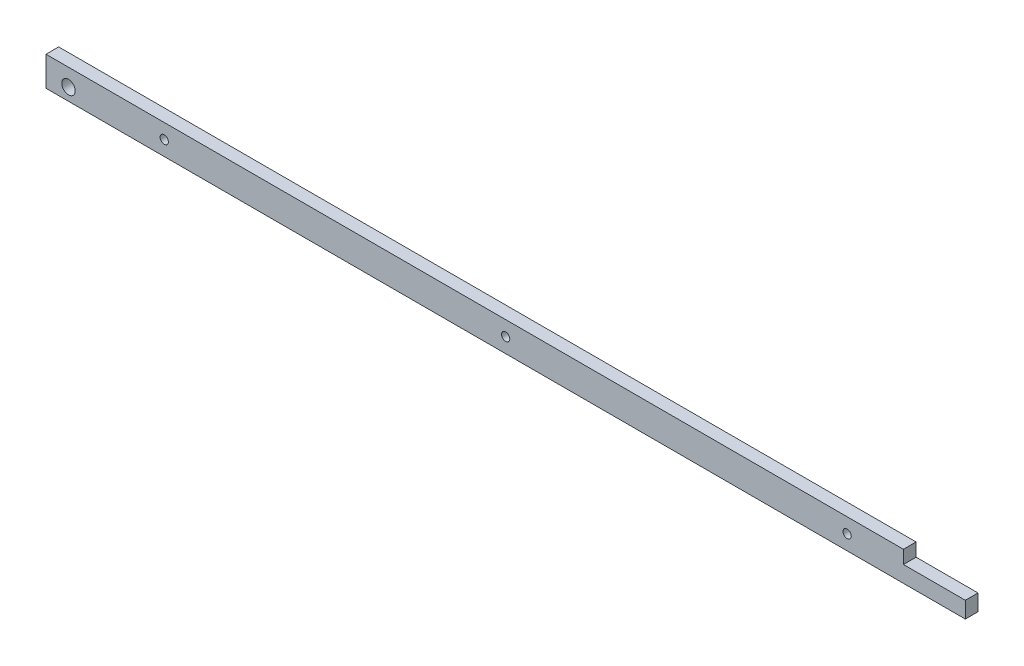
ISO-10303-21;
HEADER;
FILE_DESCRIPTION(('STEP AP214'),'2;1');
FILE_NAME('part.step','',(''),(''),'','','');
FILE_SCHEMA(('AUTOMOTIVE_DESIGN { 1 0 10303 214 1 1 1 1 }'));
ENDSEC;
DATA;
#1=APPLICATION_CONTEXT('core data for automotive mechanical design processes');
#2=APPLICATION_PROTOCOL_DEFINITION('international standard','automotive_design',2000,#1);
#3=PRODUCT_CONTEXT('',#1,'mechanical');
#4=PRODUCT('Part','Part','',(#3));
#5=PRODUCT_RELATED_PRODUCT_CATEGORY('part','',(#4));
#6=PRODUCT_DEFINITION_FORMATION('','',#4);
#7=PRODUCT_DEFINITION_CONTEXT('part definition',#1,'design');
#8=PRODUCT_DEFINITION('design','',#6,#7);
#9=PRODUCT_DEFINITION_SHAPE('','',#8);
#10=(LENGTH_UNIT() NAMED_UNIT(*) SI_UNIT(.MILLI.,.METRE.));
#11=(NAMED_UNIT(*) PLANE_ANGLE_UNIT() SI_UNIT($,.RADIAN.));
#12=(NAMED_UNIT(*) SI_UNIT($,.STERADIAN.) SOLID_ANGLE_UNIT());
#13=UNCERTAINTY_MEASURE_WITH_UNIT(LENGTH_MEASURE(1.E-05),#10,'distance_accuracy_value','');
#14=(GEOMETRIC_REPRESENTATION_CONTEXT(3) GLOBAL_UNCERTAINTY_ASSIGNED_CONTEXT((#13)) GLOBAL_UNIT_ASSIGNED_CONTEXT((#10,
#11,#12)) REPRESENTATION_CONTEXT('',''));
#15=CARTESIAN_POINT('',(0.,0.,0.));
#16=DIRECTION('',(0.,0.,1.));
#17=DIRECTION('',(1.,0.,0.));
#18=AXIS2_PLACEMENT_3D('',#15,#16,#17);
#19=CARTESIAN_POINT('',(0.,0.,-7.62));
#20=DIRECTION('',(0.,0.,1.));
#21=DIRECTION('',(-1.,0.,0.));
#22=AXIS2_PLACEMENT_3D('',#19,#20,#21);
#23=PLANE('',#22);
#24=DIRECTION('',(0.,-1.,0.));
#25=VECTOR('',#24,1.);
#26=CARTESIAN_POINT('',(-1.57859836313889E-13,-4.80058941122077,-7.62));
#27=LINE('',#26,#25);
#28=CARTESIAN_POINT('',(0.,12.9644105887762,-7.62));
#29=VERTEX_POINT('',#28);
#30=CARTESIAN_POINT('',(-1.57859836313889E-13,-4.80058941122077,-7.62));
#31=VERTEX_POINT('',#30);
#32=EDGE_CURVE('E141',#29,#31,#27,.T.);
#33=ORIENTED_EDGE('',*,*,#32,.F.);
#34=DIRECTION('',(-1.,0.,0.));
#35=VECTOR('',#34,1.);
#36=CARTESIAN_POINT('',(0.,12.9644105887762,-7.62));
#37=LINE('',#36,#35);
#38=CARTESIAN_POINT('',(515.860000058,12.9644105887792,-7.62));
#39=VERTEX_POINT('',#38);
#40=EDGE_CURVE('E121',#39,#29,#37,.T.);
#41=ORIENTED_EDGE('',*,*,#40,.F.);
#42=DIRECTION('',(0.,1.,0.));
#43=VECTOR('',#42,1.);
#44=CARTESIAN_POINT('',(515.860000058,12.9644105887792,-7.62));
#45=LINE('',#44,#43);
#46=CARTESIAN_POINT('',(515.860000058,5.01941058877617,-7.62));
#47=VERTEX_POINT('',#46);
#48=EDGE_CURVE('E102',#47,#39,#45,.T.);
#49=ORIENTED_EDGE('',*,*,#48,.F.);
#50=DIRECTION('',(-1.,0.,0.));
#51=VECTOR('',#50,1.);
#52=CARTESIAN_POINT('',(515.860000058,5.01941058877617,-7.62));
#53=LINE('',#52,#51);
#54=CARTESIAN_POINT('',(553.1,5.01941058877617,-7.62));
#55=VERTEX_POINT('',#54);
#56=EDGE_CURVE('E112',#55,#47,#53,.T.);
#57=ORIENTED_EDGE('',*,*,#56,.F.);
#58=DIRECTION('',(0.,1.,0.));
#59=VECTOR('',#58,1.);
#60=CARTESIAN_POINT('',(553.1,5.01941058877617,-7.62));
#61=LINE('',#60,#59);
#62=CARTESIAN_POINT('',(553.1,-4.80058941122084,-7.62));
#63=VERTEX_POINT('',#62);
#64=EDGE_CURVE('E117',#63,#55,#61,.T.);
#65=ORIENTED_EDGE('',*,*,#64,.F.);
#66=DIRECTION('',(1.,0.,0.));
#67=VECTOR('',#66,1.);
#68=CARTESIAN_POINT('',(-1.57859836313889E-13,-4.80058941122077,-7.62));
#69=LINE('',#68,#67);
#70=EDGE_CURVE('E146',#31,#63,#69,.T.);
#71=ORIENTED_EDGE('',*,*,#70,.F.);
#72=EDGE_LOOP('',(#33,#41,#49,#57,#65,#71));
#73=FACE_BOUND('',#72,.T.);
#74=CARTESIAN_POINT('',(481.98,4.08191058877922,-7.62));
#75=DIRECTION('',(0.,0.,1.));
#76=DIRECTION('',(1.,0.,0.));
#77=AXIS2_PLACEMENT_3D('',#74,#75,#76);
#78=CIRCLE('',#77,2.48919999999925);
#79=CARTESIAN_POINT('',(479.490800000001,4.08191058877922,-7.62));
#80=VERTEX_POINT('',#79);
#81=EDGE_CURVE('E130',#80,#80,#78,.T.);
#82=ORIENTED_EDGE('',*,*,#81,.T.);
#83=EDGE_LOOP('',(#82));
#84=FACE_BOUND('',#83,.T.);
#85=CARTESIAN_POINT('',(276.55,4.08191058877922,-7.62));
#86=DIRECTION('',(0.,0.,1.));
#87=DIRECTION('',(1.,0.,0.));
#88=AXIS2_PLACEMENT_3D('',#85,#86,#87);
#89=CIRCLE('',#88,2.48920000000001);
#90=CARTESIAN_POINT('',(274.0608,4.08191058877922,-7.62));
#91=VERTEX_POINT('',#90);
#92=EDGE_CURVE('E158',#91,#91,#89,.T.);
#93=ORIENTED_EDGE('',*,*,#92,.T.);
#94=EDGE_LOOP('',(#93));
#95=FACE_BOUND('',#94,.T.);
#96=CARTESIAN_POINT('',(71.1199999999998,4.08191058877922,-7.62));
#97=DIRECTION('',(0.,0.,1.));
#98=DIRECTION('',(1.,0.,0.));
#99=AXIS2_PLACEMENT_3D('',#96,#97,#98);
#100=CIRCLE('',#99,2.4892);
#101=CARTESIAN_POINT('',(68.6307999999998,4.08191058877922,-7.62));
#102=VERTEX_POINT('',#101);
#103=EDGE_CURVE('E164',#102,#102,#100,.T.);
#104=ORIENTED_EDGE('',*,*,#103,.T.);
#105=EDGE_LOOP('',(#104));
#106=FACE_BOUND('',#105,.T.);
#107=CARTESIAN_POINT('',(13.5399999999998,2.59941058877923,-7.62));
#108=DIRECTION('',(0.,0.,1.));
#109=DIRECTION('',(1.,0.,0.));
#110=AXIS2_PLACEMENT_3D('',#107,#108,#109);
#111=CIRCLE('',#110,4.0635);
#112=CARTESIAN_POINT('',(9.47649999999985,2.59941058877923,-7.62));
#113=VERTEX_POINT('',#112);
#114=EDGE_CURVE('E170',#113,#113,#111,.T.);
#115=ORIENTED_EDGE('',*,*,#114,.T.);
#116=EDGE_LOOP('',(#115));
#117=FACE_BOUND('',#116,.T.);
#118=ADVANCED_FACE('F41',(#73,#84,#95,#106,#117),#23,.F.);
#119=CARTESIAN_POINT('',(0.,0.,0.));
#120=DIRECTION('',(0.,0.,1.));
#121=DIRECTION('',(-1.,0.,0.));
#122=AXIS2_PLACEMENT_3D('',#119,#120,#121);
#123=PLANE('',#122);
#124=CARTESIAN_POINT('',(71.1199999999998,4.08191058877922,0.));
#125=DIRECTION('',(0.,0.,1.));
#126=DIRECTION('',(1.,0.,0.));
#127=AXIS2_PLACEMENT_3D('',#124,#125,#126);
#128=CIRCLE('',#127,2.4892);
#129=CARTESIAN_POINT('',(68.6307999999998,4.08191058877922,0.));
#130=VERTEX_POINT('',#129);
#131=EDGE_CURVE('E167',#130,#130,#128,.T.);
#132=ORIENTED_EDGE('',*,*,#131,.F.);
#133=EDGE_LOOP('',(#132));
#134=FACE_BOUND('',#133,.T.);
#135=CARTESIAN_POINT('',(481.98,4.08191058877922,0.));
#136=DIRECTION('',(0.,0.,1.));
#137=DIRECTION('',(1.,0.,0.));
#138=AXIS2_PLACEMENT_3D('',#135,#136,#137);
#139=CIRCLE('',#138,2.48919999999925);
#140=CARTESIAN_POINT('',(479.490800000001,4.08191058877922,0.));
#141=VERTEX_POINT('',#140);
#142=EDGE_CURVE('E155',#141,#141,#139,.T.);
#143=ORIENTED_EDGE('',*,*,#142,.F.);
#144=EDGE_LOOP('',(#143));
#145=FACE_BOUND('',#144,.T.);
#146=DIRECTION('',(0.,-1.,0.));
#147=VECTOR('',#146,1.);
#148=CARTESIAN_POINT('',(-1.57859836313889E-13,-4.80058941122077,0.));
#149=LINE('',#148,#147);
#150=CARTESIAN_POINT('',(0.,12.9644105887762,0.));
#151=VERTEX_POINT('',#150);
#152=CARTESIAN_POINT('',(-1.57859836313889E-13,-4.80058941122077,0.));
#153=VERTEX_POINT('',#152);
#154=EDGE_CURVE('E126',#151,#153,#149,.T.);
#155=ORIENTED_EDGE('',*,*,#154,.T.);
#156=DIRECTION('',(1.,0.,0.));
#157=VECTOR('',#156,1.);
#158=CARTESIAN_POINT('',(-1.57859836313889E-13,-4.80058941122077,0.));
#159=LINE('',#158,#157);
#160=CARTESIAN_POINT('',(553.1,-4.80058941122084,0.));
#161=VERTEX_POINT('',#160);
#162=EDGE_CURVE('E129',#153,#161,#159,.T.);
#163=ORIENTED_EDGE('',*,*,#162,.T.);
#164=DIRECTION('',(0.,1.,0.));
#165=VECTOR('',#164,1.);
#166=CARTESIAN_POINT('',(553.1,5.01941058877617,0.));
#167=LINE('',#166,#165);
#168=CARTESIAN_POINT('',(553.1,5.01941058877617,0.));
#169=VERTEX_POINT('',#168);
#170=EDGE_CURVE('E133',#161,#169,#167,.T.);
#171=ORIENTED_EDGE('',*,*,#170,.T.);
#172=DIRECTION('',(-1.,0.,0.));
#173=VECTOR('',#172,1.);
#174=CARTESIAN_POINT('',(515.860000058,5.01941058877617,0.));
#175=LINE('',#174,#173);
#176=CARTESIAN_POINT('',(515.860000058,5.01941058877617,0.));
#177=VERTEX_POINT('',#176);
#178=EDGE_CURVE('E136',#169,#177,#175,.T.);
#179=ORIENTED_EDGE('',*,*,#178,.T.);
#180=DIRECTION('',(0.,1.,0.));
#181=VECTOR('',#180,1.);
#182=CARTESIAN_POINT('',(515.860000058,12.9644105887792,0.));
#183=LINE('',#182,#181);
#184=CARTESIAN_POINT('',(515.860000058,12.9644105887792,0.));
#185=VERTEX_POINT('',#184);
#186=EDGE_CURVE('E105',#177,#185,#183,.T.);
#187=ORIENTED_EDGE('',*,*,#186,.T.);
#188=DIRECTION('',(-1.,0.,0.));
#189=VECTOR('',#188,1.);
#190=CARTESIAN_POINT('',(0.,12.9644105887762,0.));
#191=LINE('',#190,#189);
#192=EDGE_CURVE('E139',#185,#151,#191,.T.);
#193=ORIENTED_EDGE('',*,*,#192,.T.);
#194=EDGE_LOOP('',(#155,#163,#171,#179,#187,#193));
#195=FACE_BOUND('',#194,.T.);
#196=CARTESIAN_POINT('',(276.55,4.08191058877922,0.));
#197=DIRECTION('',(0.,0.,1.));
#198=DIRECTION('',(1.,0.,0.));
#199=AXIS2_PLACEMENT_3D('',#196,#197,#198);
#200=CIRCLE('',#199,2.48920000000001);
#201=CARTESIAN_POINT('',(274.0608,4.08191058877922,0.));
#202=VERTEX_POINT('',#201);
#203=EDGE_CURVE('E161',#202,#202,#200,.T.);
#204=ORIENTED_EDGE('',*,*,#203,.F.);
#205=EDGE_LOOP('',(#204));
#206=FACE_BOUND('',#205,.T.);
#207=CARTESIAN_POINT('',(13.5399999999998,2.59941058877923,0.));
#208=DIRECTION('',(0.,0.,1.));
#209=DIRECTION('',(1.,0.,0.));
#210=AXIS2_PLACEMENT_3D('',#207,#208,#209);
#211=CIRCLE('',#210,4.0635);
#212=CARTESIAN_POINT('',(9.47649999999985,2.59941058877923,0.));
#213=VERTEX_POINT('',#212);
#214=EDGE_CURVE('E173',#213,#213,#211,.T.);
#215=ORIENTED_EDGE('',*,*,#214,.F.);
#216=EDGE_LOOP('',(#215));
#217=FACE_BOUND('',#216,.T.);
#218=ADVANCED_FACE('F150',(#134,#145,#195,#206,#217),#123,.T.);
#219=CARTESIAN_POINT('',(-1.57859836313889E-13,-4.80058941122077,-7.62));
#220=DIRECTION('',(1.,0.,0.));
#221=DIRECTION('',(0.,1.,0.));
#222=AXIS2_PLACEMENT_3D('',#219,#220,#221);
#223=PLANE('',#222);
#224=ORIENTED_EDGE('',*,*,#154,.F.);
#225=DIRECTION('',(0.,0.,1.));
#226=VECTOR('',#225,1.);
#227=CARTESIAN_POINT('',(0.,12.9644105887762,-7.62));
#228=LINE('',#227,#226);
#229=EDGE_CURVE('E58',#29,#151,#228,.T.);
#230=ORIENTED_EDGE('',*,*,#229,.F.);
#231=ORIENTED_EDGE('',*,*,#32,.T.);
#232=DIRECTION('',(0.,0.,1.));
#233=VECTOR('',#232,1.);
#234=CARTESIAN_POINT('',(-1.57859836313889E-13,-4.80058941122077,-7.62));
#235=LINE('',#234,#233);
#236=EDGE_CURVE('E11',#31,#153,#235,.T.);
#237=ORIENTED_EDGE('',*,*,#236,.T.);
#238=EDGE_LOOP('',(#224,#230,#231,#237));
#239=FACE_BOUND('',#238,.T.);
#240=ADVANCED_FACE('F43',(#239),#223,.F.);
#241=CARTESIAN_POINT('',(-1.57859836313889E-13,-4.80058941122077,-7.62));
#242=DIRECTION('',(0.,1.,0.));
#243=DIRECTION('',(-1.,0.,0.));
#244=AXIS2_PLACEMENT_3D('',#241,#242,#243);
#245=PLANE('',#244);
#246=ORIENTED_EDGE('',*,*,#162,.F.);
#247=ORIENTED_EDGE('',*,*,#236,.F.);
#248=ORIENTED_EDGE('',*,*,#70,.T.);
#249=DIRECTION('',(0.,0.,1.));
#250=VECTOR('',#249,1.);
#251=CARTESIAN_POINT('',(553.1,-4.80058941122084,-7.62));
#252=LINE('',#251,#250);
#253=EDGE_CURVE('E50',#63,#161,#252,.T.);
#254=ORIENTED_EDGE('',*,*,#253,.T.);
#255=EDGE_LOOP('',(#246,#247,#248,#254));
#256=FACE_BOUND('',#255,.T.);
#257=ADVANCED_FACE('F145',(#256),#245,.F.);
#258=CARTESIAN_POINT('',(553.1,5.01941058877617,-7.62));
#259=DIRECTION('',(-1.,0.,0.));
#260=DIRECTION('',(0.,0.,-1.));
#261=AXIS2_PLACEMENT_3D('',#258,#259,#260);
#262=PLANE('',#261);
#263=ORIENTED_EDGE('',*,*,#170,.F.);
#264=ORIENTED_EDGE('',*,*,#253,.F.);
#265=ORIENTED_EDGE('',*,*,#64,.T.);
#266=DIRECTION('',(0.,0.,1.));
#267=VECTOR('',#266,1.);
#268=CARTESIAN_POINT('',(553.1,5.01941058877617,-7.62));
#269=LINE('',#268,#267);
#270=EDGE_CURVE('E109',#55,#169,#269,.T.);
#271=ORIENTED_EDGE('',*,*,#270,.T.);
#272=EDGE_LOOP('',(#263,#264,#265,#271));
#273=FACE_BOUND('',#272,.T.);
#274=ADVANCED_FACE('F148',(#273),#262,.F.);
#275=CARTESIAN_POINT('',(515.860000058,5.01941058877617,-7.62));
#276=DIRECTION('',(0.,-1.,0.));
#277=DIRECTION('',(0.,0.,1.));
#278=AXIS2_PLACEMENT_3D('',#275,#276,#277);
#279=PLANE('',#278);
#280=ORIENTED_EDGE('',*,*,#178,.F.);
#281=ORIENTED_EDGE('',*,*,#270,.F.);
#282=ORIENTED_EDGE('',*,*,#56,.T.);
#283=DIRECTION('',(0.,0.,1.));
#284=VECTOR('',#283,1.);
#285=CARTESIAN_POINT('',(515.860000058,5.01941058877617,-7.62));
#286=LINE('',#285,#284);
#287=EDGE_CURVE('E98',#47,#177,#286,.T.);
#288=ORIENTED_EDGE('',*,*,#287,.T.);
#289=EDGE_LOOP('',(#280,#281,#282,#288));
#290=FACE_BOUND('',#289,.T.);
#291=ADVANCED_FACE('F113',(#290),#279,.F.);
#292=CARTESIAN_POINT('',(515.860000058,12.9644105887792,-7.62));
#293=DIRECTION('',(-1.,0.,0.));
#294=DIRECTION('',(0.,0.,-1.));
#295=AXIS2_PLACEMENT_3D('',#292,#293,#294);
#296=PLANE('',#295);
#297=ORIENTED_EDGE('',*,*,#186,.F.);
#298=ORIENTED_EDGE('',*,*,#287,.F.);
#299=ORIENTED_EDGE('',*,*,#48,.T.);
#300=DIRECTION('',(0.,0.,1.));
#301=VECTOR('',#300,1.);
#302=CARTESIAN_POINT('',(515.860000058,12.9644105887792,-7.62));
#303=LINE('',#302,#301);
#304=EDGE_CURVE('E80',#39,#185,#303,.T.);
#305=ORIENTED_EDGE('',*,*,#304,.T.);
#306=EDGE_LOOP('',(#297,#298,#299,#305));
#307=FACE_BOUND('',#306,.T.);
#308=ADVANCED_FACE('F100',(#307),#296,.F.);
#309=CARTESIAN_POINT('',(0.,12.9644105887762,-7.62));
#310=DIRECTION('',(0.,-1.,0.));
#311=DIRECTION('',(1.,0.,0.));
#312=AXIS2_PLACEMENT_3D('',#309,#310,#311);
#313=PLANE('',#312);
#314=ORIENTED_EDGE('',*,*,#192,.F.);
#315=ORIENTED_EDGE('',*,*,#304,.F.);
#316=ORIENTED_EDGE('',*,*,#40,.T.);
#317=ORIENTED_EDGE('',*,*,#229,.T.);
#318=EDGE_LOOP('',(#314,#315,#316,#317));
#319=FACE_BOUND('',#318,.T.);
#320=ADVANCED_FACE('F199',(#319),#313,.F.);
#321=CARTESIAN_POINT('',(481.98,4.08191058877922,-7.62));
#322=DIRECTION('',(0.,0.,1.));
#323=DIRECTION('',(-1.,0.,0.));
#324=AXIS2_PLACEMENT_3D('',#321,#322,#323);
#325=CYLINDRICAL_SURFACE('',#324,2.48919999999925);
#326=CARTESIAN_POINT('',(479.490800000001,4.08191058877922,-7.62));
#327=CARTESIAN_POINT('',(479.490800000001,4.08191058877922,-7.540625));
#328=CARTESIAN_POINT('',(479.490800000001,4.08191058877922,-7.46125));
#329=CARTESIAN_POINT('',(479.490800000001,4.08191058877922,-7.3025));
#330=CARTESIAN_POINT('',(479.490800000001,4.08191058877922,-7.223125));
#331=CARTESIAN_POINT('',(479.490800000001,4.08191058877922,-7.064375));
#332=CARTESIAN_POINT('',(479.490800000001,4.08191058877922,-6.985));
#333=CARTESIAN_POINT('',(479.490800000001,4.08191058877922,-6.82625));
#334=CARTESIAN_POINT('',(479.490800000001,4.08191058877922,-6.746875));
#335=CARTESIAN_POINT('',(479.490800000001,4.08191058877922,-6.588125));
#336=CARTESIAN_POINT('',(479.490800000001,4.08191058877922,-6.50875));
#337=CARTESIAN_POINT('',(479.490800000001,4.08191058877922,-6.35));
#338=CARTESIAN_POINT('',(479.490800000001,4.08191058877922,-6.270625));
#339=CARTESIAN_POINT('',(479.490800000001,4.08191058877922,-6.111875));
#340=CARTESIAN_POINT('',(479.490800000001,4.08191058877922,-6.0325));
#341=CARTESIAN_POINT('',(479.490800000001,4.08191058877922,-5.87375));
#342=CARTESIAN_POINT('',(479.490800000001,4.08191058877922,-5.794375));
#343=CARTESIAN_POINT('',(479.490800000001,4.08191058877922,-5.635625));
#344=CARTESIAN_POINT('',(479.490800000001,4.08191058877922,-5.55625));
#345=CARTESIAN_POINT('',(479.490800000001,4.08191058877922,-5.3975));
#346=CARTESIAN_POINT('',(479.490800000001,4.08191058877922,-5.318125));
#347=CARTESIAN_POINT('',(479.490800000001,4.08191058877922,-5.159375));
#348=CARTESIAN_POINT('',(479.490800000001,4.08191058877922,-5.08));
#349=CARTESIAN_POINT('',(479.490800000001,4.08191058877922,-4.92125));
#350=CARTESIAN_POINT('',(479.490800000001,4.08191058877922,-4.841875));
#351=CARTESIAN_POINT('',(479.490800000001,4.08191058877922,-4.683125));
#352=CARTESIAN_POINT('',(479.490800000001,4.08191058877922,-4.60375));
#353=CARTESIAN_POINT('',(479.490800000001,4.08191058877922,-4.445));
#354=CARTESIAN_POINT('',(479.490800000001,4.08191058877922,-4.365625));
#355=CARTESIAN_POINT('',(479.490800000001,4.08191058877922,-4.206875));
#356=CARTESIAN_POINT('',(479.490800000001,4.08191058877922,-4.1275));
#357=CARTESIAN_POINT('',(479.490800000001,4.08191058877922,-3.96875));
#358=CARTESIAN_POINT('',(479.490800000001,4.08191058877922,-3.889375));
#359=CARTESIAN_POINT('',(479.490800000001,4.08191058877922,-3.730625));
#360=CARTESIAN_POINT('',(479.490800000001,4.08191058877922,-3.65125));
#361=CARTESIAN_POINT('',(479.490800000001,4.08191058877922,-3.4925));
#362=CARTESIAN_POINT('',(479.490800000001,4.08191058877922,-3.413125));
#363=CARTESIAN_POINT('',(479.490800000001,4.08191058877922,-3.254375));
#364=CARTESIAN_POINT('',(479.490800000001,4.08191058877922,-3.175));
#365=CARTESIAN_POINT('',(479.490800000001,4.08191058877922,-3.01625));
#366=CARTESIAN_POINT('',(479.490800000001,4.08191058877922,-2.936875));
#367=CARTESIAN_POINT('',(479.490800000001,4.08191058877922,-2.778125));
#368=CARTESIAN_POINT('',(479.490800000001,4.08191058877922,-2.69875));
#369=CARTESIAN_POINT('',(479.490800000001,4.08191058877922,-2.54));
#370=CARTESIAN_POINT('',(479.490800000001,4.08191058877922,-2.460625));
#371=CARTESIAN_POINT('',(479.490800000001,4.08191058877922,-2.301875));
#372=CARTESIAN_POINT('',(479.490800000001,4.08191058877922,-2.2225));
#373=CARTESIAN_POINT('',(479.490800000001,4.08191058877922,-2.06375));
#374=CARTESIAN_POINT('',(479.490800000001,4.08191058877922,-1.984375));
#375=CARTESIAN_POINT('',(479.490800000001,4.08191058877922,-1.825625));
#376=CARTESIAN_POINT('',(479.490800000001,4.08191058877922,-1.74625));
#377=CARTESIAN_POINT('',(479.490800000001,4.08191058877922,-1.5875));
#378=CARTESIAN_POINT('',(479.490800000001,4.08191058877922,-1.508125));
#379=CARTESIAN_POINT('',(479.490800000001,4.08191058877922,-1.349375));
#380=CARTESIAN_POINT('',(479.490800000001,4.08191058877922,-1.27));
#381=CARTESIAN_POINT('',(479.490800000001,4.08191058877922,-1.11125));
#382=CARTESIAN_POINT('',(479.490800000001,4.08191058877922,-1.031875));
#383=CARTESIAN_POINT('',(479.490800000001,4.08191058877922,-0.873125));
#384=CARTESIAN_POINT('',(479.490800000001,4.08191058877922,-0.79375));
#385=CARTESIAN_POINT('',(479.490800000001,4.08191058877922,-0.635));
#386=CARTESIAN_POINT('',(479.490800000001,4.08191058877922,-0.555625));
#387=CARTESIAN_POINT('',(479.490800000001,4.08191058877922,-0.396875));
#388=CARTESIAN_POINT('',(479.490800000001,4.08191058877922,-0.3175));
#389=CARTESIAN_POINT('',(479.490800000001,4.08191058877922,-0.15875));
#390=CARTESIAN_POINT('',(479.490800000001,4.08191058877922,-0.0793749999999999));
#391=CARTESIAN_POINT('',(479.490800000001,4.08191058877922,0.));
#392=B_SPLINE_CURVE_WITH_KNOTS('',3,(#326,#327,#328,#329,#330,#331,#332,#333,#334,#335,#336,
#337,#338,#339,#340,#341,#342,#343,#344,#345,#346,#347,#348,#349,#350,#351,#352,#353,#354,#355,
#356,#357,#358,#359,#360,#361,#362,#363,#364,#365,#366,#367,#368,#369,#370,#371,#372,#373,#374,
#375,#376,#377,#378,#379,#380,#381,#382,#383,#384,#385,#386,#387,#388,#389,#390,#391),
.UNSPECIFIED.,.F.,.F.,(4,2,2,2,2,2,2,2,2,2,2,2,2,2,2,2,2,2,2,2,2,2,2,2,2,2,2,2,2,2,2,2,4),(0.,
0.238125,0.476249999999999,0.714375,0.952499999999999,1.190625,1.42875,1.666875,1.905,2.143125,
2.38125,2.619375,2.8575,3.095625,3.33375,3.571875,3.81,4.048125,4.28625,4.524375,4.7625,
5.000625,5.23875,5.476875,5.715,5.953125,6.19125,6.429375,6.6675,6.905625,7.14375,7.381875,
7.62),.UNSPECIFIED.);
#393=EDGE_CURVE('BSEAM202',#80,#141,#392,.T.);
#394=ORIENTED_EDGE('',*,*,#81,.F.);
#395=ORIENTED_EDGE('',*,*,#142,.T.);
#396=ORIENTED_EDGE('',*,*,#393,.T.);
#397=ORIENTED_EDGE('',*,*,#393,.F.);
#398=EDGE_LOOP('',(#394,#396,#395,#397));
#399=FACE_BOUND('',#398,.T.);
#400=ADVANCED_FACE('F202',(#399),#325,.F.);
#401=CARTESIAN_POINT('',(276.55,4.08191058877922,-7.62));
#402=DIRECTION('',(0.,0.,1.));
#403=DIRECTION('',(-1.,0.,0.));
#404=AXIS2_PLACEMENT_3D('',#401,#402,#403);
#405=CYLINDRICAL_SURFACE('',#404,2.48920000000001);
#406=CARTESIAN_POINT('',(274.0608,4.08191058877922,-7.62));
#407=CARTESIAN_POINT('',(274.0608,4.08191058877922,-7.540625));
#408=CARTESIAN_POINT('',(274.0608,4.08191058877922,-7.46125));
#409=CARTESIAN_POINT('',(274.0608,4.08191058877922,-7.3025));
#410=CARTESIAN_POINT('',(274.0608,4.08191058877922,-7.223125));
#411=CARTESIAN_POINT('',(274.0608,4.08191058877922,-7.064375));
#412=CARTESIAN_POINT('',(274.0608,4.08191058877922,-6.985));
#413=CARTESIAN_POINT('',(274.0608,4.08191058877922,-6.82625));
#414=CARTESIAN_POINT('',(274.0608,4.08191058877922,-6.746875));
#415=CARTESIAN_POINT('',(274.0608,4.08191058877922,-6.588125));
#416=CARTESIAN_POINT('',(274.0608,4.08191058877922,-6.50875));
#417=CARTESIAN_POINT('',(274.0608,4.08191058877922,-6.35));
#418=CARTESIAN_POINT('',(274.0608,4.08191058877922,-6.270625));
#419=CARTESIAN_POINT('',(274.0608,4.08191058877922,-6.111875));
#420=CARTESIAN_POINT('',(274.0608,4.08191058877922,-6.0325));
#421=CARTESIAN_POINT('',(274.0608,4.08191058877922,-5.87375));
#422=CARTESIAN_POINT('',(274.0608,4.08191058877922,-5.794375));
#423=CARTESIAN_POINT('',(274.0608,4.08191058877922,-5.635625));
#424=CARTESIAN_POINT('',(274.0608,4.08191058877922,-5.55625));
#425=CARTESIAN_POINT('',(274.0608,4.08191058877922,-5.3975));
#426=CARTESIAN_POINT('',(274.0608,4.08191058877922,-5.318125));
#427=CARTESIAN_POINT('',(274.0608,4.08191058877922,-5.159375));
#428=CARTESIAN_POINT('',(274.0608,4.08191058877922,-5.08));
#429=CARTESIAN_POINT('',(274.0608,4.08191058877922,-4.92125));
#430=CARTESIAN_POINT('',(274.0608,4.08191058877922,-4.841875));
#431=CARTESIAN_POINT('',(274.0608,4.08191058877922,-4.683125));
#432=CARTESIAN_POINT('',(274.0608,4.08191058877922,-4.60375));
#433=CARTESIAN_POINT('',(274.0608,4.08191058877922,-4.445));
#434=CARTESIAN_POINT('',(274.0608,4.08191058877922,-4.365625));
#435=CARTESIAN_POINT('',(274.0608,4.08191058877922,-4.206875));
#436=CARTESIAN_POINT('',(274.0608,4.08191058877922,-4.1275));
#437=CARTESIAN_POINT('',(274.0608,4.08191058877922,-3.96875));
#438=CARTESIAN_POINT('',(274.0608,4.08191058877922,-3.889375));
#439=CARTESIAN_POINT('',(274.0608,4.08191058877922,-3.730625));
#440=CARTESIAN_POINT('',(274.0608,4.08191058877922,-3.65125));
#441=CARTESIAN_POINT('',(274.0608,4.08191058877922,-3.4925));
#442=CARTESIAN_POINT('',(274.0608,4.08191058877922,-3.413125));
#443=CARTESIAN_POINT('',(274.0608,4.08191058877922,-3.254375));
#444=CARTESIAN_POINT('',(274.0608,4.08191058877922,-3.175));
#445=CARTESIAN_POINT('',(274.0608,4.08191058877922,-3.01625));
#446=CARTESIAN_POINT('',(274.0608,4.08191058877922,-2.936875));
#447=CARTESIAN_POINT('',(274.0608,4.08191058877922,-2.778125));
#448=CARTESIAN_POINT('',(274.0608,4.08191058877922,-2.69875));
#449=CARTESIAN_POINT('',(274.0608,4.08191058877922,-2.54));
#450=CARTESIAN_POINT('',(274.0608,4.08191058877922,-2.460625));
#451=CARTESIAN_POINT('',(274.0608,4.08191058877922,-2.301875));
#452=CARTESIAN_POINT('',(274.0608,4.08191058877922,-2.2225));
#453=CARTESIAN_POINT('',(274.0608,4.08191058877922,-2.06375));
#454=CARTESIAN_POINT('',(274.0608,4.08191058877922,-1.984375));
#455=CARTESIAN_POINT('',(274.0608,4.08191058877922,-1.825625));
#456=CARTESIAN_POINT('',(274.0608,4.08191058877922,-1.74625));
#457=CARTESIAN_POINT('',(274.0608,4.08191058877922,-1.5875));
#458=CARTESIAN_POINT('',(274.0608,4.08191058877922,-1.508125));
#459=CARTESIAN_POINT('',(274.0608,4.08191058877922,-1.349375));
#460=CARTESIAN_POINT('',(274.0608,4.08191058877922,-1.27));
#461=CARTESIAN_POINT('',(274.0608,4.08191058877922,-1.11125));
#462=CARTESIAN_POINT('',(274.0608,4.08191058877922,-1.031875));
#463=CARTESIAN_POINT('',(274.0608,4.08191058877922,-0.873125));
#464=CARTESIAN_POINT('',(274.0608,4.08191058877922,-0.79375));
#465=CARTESIAN_POINT('',(274.0608,4.08191058877922,-0.635));
#466=CARTESIAN_POINT('',(274.0608,4.08191058877922,-0.555625));
#467=CARTESIAN_POINT('',(274.0608,4.08191058877922,-0.396875));
#468=CARTESIAN_POINT('',(274.0608,4.08191058877922,-0.3175));
#469=CARTESIAN_POINT('',(274.0608,4.08191058877922,-0.15875));
#470=CARTESIAN_POINT('',(274.0608,4.08191058877922,-0.0793749999999999));
#471=CARTESIAN_POINT('',(274.0608,4.08191058877922,0.));
#472=B_SPLINE_CURVE_WITH_KNOTS('',3,(#406,#407,#408,#409,#410,#411,#412,#413,#414,#415,#416,
#417,#418,#419,#420,#421,#422,#423,#424,#425,#426,#427,#428,#429,#430,#431,#432,#433,#434,#435,
#436,#437,#438,#439,#440,#441,#442,#443,#444,#445,#446,#447,#448,#449,#450,#451,#452,#453,#454,
#455,#456,#457,#458,#459,#460,#461,#462,#463,#464,#465,#466,#467,#468,#469,#470,#471),
.UNSPECIFIED.,.F.,.F.,(4,2,2,2,2,2,2,2,2,2,2,2,2,2,2,2,2,2,2,2,2,2,2,2,2,2,2,2,2,2,2,2,4),(0.,
0.238125,0.476249999999999,0.714375,0.952499999999999,1.190625,1.42875,1.666875,1.905,2.143125,
2.38125,2.619375,2.8575,3.095625,3.33375,3.571875,3.81,4.048125,4.28625,4.524375,4.7625,
5.000625,5.23875,5.476875,5.715,5.953125,6.19125,6.429375,6.6675,6.905625,7.14375,7.381875,
7.62),.UNSPECIFIED.);
#473=EDGE_CURVE('BSEAM240',#91,#202,#472,.T.);
#474=ORIENTED_EDGE('',*,*,#92,.F.);
#475=ORIENTED_EDGE('',*,*,#203,.T.);
#476=ORIENTED_EDGE('',*,*,#473,.T.);
#477=ORIENTED_EDGE('',*,*,#473,.F.);
#478=EDGE_LOOP('',(#474,#476,#475,#477));
#479=FACE_BOUND('',#478,.T.);
#480=ADVANCED_FACE('F240',(#479),#405,.F.);
#481=CARTESIAN_POINT('',(71.1199999999998,4.08191058877922,-7.62));
#482=DIRECTION('',(0.,0.,1.));
#483=DIRECTION('',(-1.,0.,0.));
#484=AXIS2_PLACEMENT_3D('',#481,#482,#483);
#485=CYLINDRICAL_SURFACE('',#484,2.4892);
#486=CARTESIAN_POINT('',(68.6307999999998,4.08191058877922,-7.62));
#487=CARTESIAN_POINT('',(68.6307999999998,4.08191058877922,-7.540625));
#488=CARTESIAN_POINT('',(68.6307999999998,4.08191058877922,-7.46125));
#489=CARTESIAN_POINT('',(68.6307999999998,4.08191058877922,-7.3025));
#490=CARTESIAN_POINT('',(68.6307999999998,4.08191058877922,-7.223125));
#491=CARTESIAN_POINT('',(68.6307999999998,4.08191058877922,-7.064375));
#492=CARTESIAN_POINT('',(68.6307999999998,4.08191058877922,-6.985));
#493=CARTESIAN_POINT('',(68.6307999999998,4.08191058877922,-6.82625));
#494=CARTESIAN_POINT('',(68.6307999999998,4.08191058877922,-6.746875));
#495=CARTESIAN_POINT('',(68.6307999999998,4.08191058877922,-6.588125));
#496=CARTESIAN_POINT('',(68.6307999999998,4.08191058877922,-6.50875));
#497=CARTESIAN_POINT('',(68.6307999999998,4.08191058877922,-6.35));
#498=CARTESIAN_POINT('',(68.6307999999998,4.08191058877922,-6.270625));
#499=CARTESIAN_POINT('',(68.6307999999998,4.08191058877922,-6.111875));
#500=CARTESIAN_POINT('',(68.6307999999998,4.08191058877922,-6.0325));
#501=CARTESIAN_POINT('',(68.6307999999998,4.08191058877922,-5.87375));
#502=CARTESIAN_POINT('',(68.6307999999998,4.08191058877922,-5.794375));
#503=CARTESIAN_POINT('',(68.6307999999998,4.08191058877922,-5.635625));
#504=CARTESIAN_POINT('',(68.6307999999998,4.08191058877922,-5.55625));
#505=CARTESIAN_POINT('',(68.6307999999998,4.08191058877922,-5.3975));
#506=CARTESIAN_POINT('',(68.6307999999998,4.08191058877922,-5.318125));
#507=CARTESIAN_POINT('',(68.6307999999998,4.08191058877922,-5.159375));
#508=CARTESIAN_POINT('',(68.6307999999998,4.08191058877922,-5.08));
#509=CARTESIAN_POINT('',(68.6307999999998,4.08191058877922,-4.92125));
#510=CARTESIAN_POINT('',(68.6307999999998,4.08191058877922,-4.841875));
#511=CARTESIAN_POINT('',(68.6307999999998,4.08191058877922,-4.683125));
#512=CARTESIAN_POINT('',(68.6307999999998,4.08191058877922,-4.60375));
#513=CARTESIAN_POINT('',(68.6307999999998,4.08191058877922,-4.445));
#514=CARTESIAN_POINT('',(68.6307999999998,4.08191058877922,-4.365625));
#515=CARTESIAN_POINT('',(68.6307999999998,4.08191058877922,-4.206875));
#516=CARTESIAN_POINT('',(68.6307999999998,4.08191058877922,-4.1275));
#517=CARTESIAN_POINT('',(68.6307999999998,4.08191058877922,-3.96875));
#518=CARTESIAN_POINT('',(68.6307999999998,4.08191058877922,-3.889375));
#519=CARTESIAN_POINT('',(68.6307999999998,4.08191058877922,-3.730625));
#520=CARTESIAN_POINT('',(68.6307999999998,4.08191058877922,-3.65125));
#521=CARTESIAN_POINT('',(68.6307999999998,4.08191058877922,-3.4925));
#522=CARTESIAN_POINT('',(68.6307999999998,4.08191058877922,-3.413125));
#523=CARTESIAN_POINT('',(68.6307999999998,4.08191058877922,-3.254375));
#524=CARTESIAN_POINT('',(68.6307999999998,4.08191058877922,-3.175));
#525=CARTESIAN_POINT('',(68.6307999999998,4.08191058877922,-3.01625));
#526=CARTESIAN_POINT('',(68.6307999999998,4.08191058877922,-2.936875));
#527=CARTESIAN_POINT('',(68.6307999999998,4.08191058877922,-2.778125));
#528=CARTESIAN_POINT('',(68.6307999999998,4.08191058877922,-2.69875));
#529=CARTESIAN_POINT('',(68.6307999999998,4.08191058877922,-2.54));
#530=CARTESIAN_POINT('',(68.6307999999998,4.08191058877922,-2.460625));
#531=CARTESIAN_POINT('',(68.6307999999998,4.08191058877922,-2.301875));
#532=CARTESIAN_POINT('',(68.6307999999998,4.08191058877922,-2.2225));
#533=CARTESIAN_POINT('',(68.6307999999998,4.08191058877922,-2.06375));
#534=CARTESIAN_POINT('',(68.6307999999998,4.08191058877922,-1.984375));
#535=CARTESIAN_POINT('',(68.6307999999998,4.08191058877922,-1.825625));
#536=CARTESIAN_POINT('',(68.6307999999998,4.08191058877922,-1.74625));
#537=CARTESIAN_POINT('',(68.6307999999998,4.08191058877922,-1.5875));
#538=CARTESIAN_POINT('',(68.6307999999998,4.08191058877922,-1.508125));
#539=CARTESIAN_POINT('',(68.6307999999998,4.08191058877922,-1.349375));
#540=CARTESIAN_POINT('',(68.6307999999998,4.08191058877922,-1.27));
#541=CARTESIAN_POINT('',(68.6307999999998,4.08191058877922,-1.11125));
#542=CARTESIAN_POINT('',(68.6307999999998,4.08191058877922,-1.031875));
#543=CARTESIAN_POINT('',(68.6307999999998,4.08191058877922,-0.873125));
#544=CARTESIAN_POINT('',(68.6307999999998,4.08191058877922,-0.79375));
#545=CARTESIAN_POINT('',(68.6307999999998,4.08191058877922,-0.635));
#546=CARTESIAN_POINT('',(68.6307999999998,4.08191058877922,-0.555625));
#547=CARTESIAN_POINT('',(68.6307999999998,4.08191058877922,-0.396875));
#548=CARTESIAN_POINT('',(68.6307999999998,4.08191058877922,-0.3175));
#549=CARTESIAN_POINT('',(68.6307999999998,4.08191058877922,-0.15875));
#550=CARTESIAN_POINT('',(68.6307999999998,4.08191058877922,-0.0793749999999999));
#551=CARTESIAN_POINT('',(68.6307999999998,4.08191058877922,0.));
#552=B_SPLINE_CURVE_WITH_KNOTS('',3,(#486,#487,#488,#489,#490,#491,#492,#493,#494,#495,#496,
#497,#498,#499,#500,#501,#502,#503,#504,#505,#506,#507,#508,#509,#510,#511,#512,#513,#514,#515,
#516,#517,#518,#519,#520,#521,#522,#523,#524,#525,#526,#527,#528,#529,#530,#531,#532,#533,#534,
#535,#536,#537,#538,#539,#540,#541,#542,#543,#544,#545,#546,#547,#548,#549,#550,#551),
.UNSPECIFIED.,.F.,.F.,(4,2,2,2,2,2,2,2,2,2,2,2,2,2,2,2,2,2,2,2,2,2,2,2,2,2,2,2,2,2,2,2,4),(0.,
0.238125,0.476249999999999,0.714375,0.952499999999999,1.190625,1.42875,1.666875,1.905,2.143125,
2.38125,2.619375,2.8575,3.095625,3.33375,3.571875,3.81,4.048125,4.28625,4.524375,4.7625,
5.000625,5.23875,5.476875,5.715,5.953125,6.19125,6.429375,6.6675,6.905625,7.14375,7.381875,
7.62),.UNSPECIFIED.);
#553=EDGE_CURVE('BSEAM183',#102,#130,#552,.T.);
#554=ORIENTED_EDGE('',*,*,#103,.F.);
#555=ORIENTED_EDGE('',*,*,#131,.T.);
#556=ORIENTED_EDGE('',*,*,#553,.T.);
#557=ORIENTED_EDGE('',*,*,#553,.F.);
#558=EDGE_LOOP('',(#554,#556,#555,#557));
#559=FACE_BOUND('',#558,.T.);
#560=ADVANCED_FACE('F183',(#559),#485,.F.);
#561=CARTESIAN_POINT('',(13.5399999999998,2.59941058877923,-7.62));
#562=DIRECTION('',(0.,0.,1.));
#563=DIRECTION('',(-1.,0.,0.));
#564=AXIS2_PLACEMENT_3D('',#561,#562,#563);
#565=CYLINDRICAL_SURFACE('',#564,4.0635);
#566=CARTESIAN_POINT('',(9.47649999999985,2.59941058877923,-7.62));
#567=CARTESIAN_POINT('',(9.47649999999985,2.59941058877923,-7.540625));
#568=CARTESIAN_POINT('',(9.47649999999985,2.59941058877923,-7.46125));
#569=CARTESIAN_POINT('',(9.47649999999985,2.59941058877923,-7.3025));
#570=CARTESIAN_POINT('',(9.47649999999985,2.59941058877923,-7.223125));
#571=CARTESIAN_POINT('',(9.47649999999985,2.59941058877923,-7.064375));
#572=CARTESIAN_POINT('',(9.47649999999985,2.59941058877923,-6.985));
#573=CARTESIAN_POINT('',(9.47649999999985,2.59941058877923,-6.82625));
#574=CARTESIAN_POINT('',(9.47649999999985,2.59941058877923,-6.746875));
#575=CARTESIAN_POINT('',(9.47649999999985,2.59941058877923,-6.588125));
#576=CARTESIAN_POINT('',(9.47649999999985,2.59941058877923,-6.50875));
#577=CARTESIAN_POINT('',(9.47649999999985,2.59941058877923,-6.35));
#578=CARTESIAN_POINT('',(9.47649999999985,2.59941058877923,-6.270625));
#579=CARTESIAN_POINT('',(9.47649999999985,2.59941058877923,-6.111875));
#580=CARTESIAN_POINT('',(9.47649999999985,2.59941058877923,-6.0325));
#581=CARTESIAN_POINT('',(9.47649999999985,2.59941058877923,-5.87375));
#582=CARTESIAN_POINT('',(9.47649999999985,2.59941058877923,-5.794375));
#583=CARTESIAN_POINT('',(9.47649999999985,2.59941058877923,-5.635625));
#584=CARTESIAN_POINT('',(9.47649999999985,2.59941058877923,-5.55625));
#585=CARTESIAN_POINT('',(9.47649999999985,2.59941058877923,-5.3975));
#586=CARTESIAN_POINT('',(9.47649999999985,2.59941058877923,-5.318125));
#587=CARTESIAN_POINT('',(9.47649999999985,2.59941058877923,-5.159375));
#588=CARTESIAN_POINT('',(9.47649999999985,2.59941058877923,-5.08));
#589=CARTESIAN_POINT('',(9.47649999999985,2.59941058877923,-4.92125));
#590=CARTESIAN_POINT('',(9.47649999999985,2.59941058877923,-4.841875));
#591=CARTESIAN_POINT('',(9.47649999999985,2.59941058877923,-4.683125));
#592=CARTESIAN_POINT('',(9.47649999999985,2.59941058877923,-4.60375));
#593=CARTESIAN_POINT('',(9.47649999999985,2.59941058877923,-4.445));
#594=CARTESIAN_POINT('',(9.47649999999985,2.59941058877923,-4.365625));
#595=CARTESIAN_POINT('',(9.47649999999985,2.59941058877923,-4.206875));
#596=CARTESIAN_POINT('',(9.47649999999985,2.59941058877923,-4.1275));
#597=CARTESIAN_POINT('',(9.47649999999985,2.59941058877923,-3.96875));
#598=CARTESIAN_POINT('',(9.47649999999985,2.59941058877923,-3.889375));
#599=CARTESIAN_POINT('',(9.47649999999985,2.59941058877923,-3.730625));
#600=CARTESIAN_POINT('',(9.47649999999985,2.59941058877923,-3.65125));
#601=CARTESIAN_POINT('',(9.47649999999985,2.59941058877923,-3.4925));
#602=CARTESIAN_POINT('',(9.47649999999985,2.59941058877923,-3.413125));
#603=CARTESIAN_POINT('',(9.47649999999985,2.59941058877923,-3.254375));
#604=CARTESIAN_POINT('',(9.47649999999985,2.59941058877923,-3.175));
#605=CARTESIAN_POINT('',(9.47649999999985,2.59941058877923,-3.01625));
#606=CARTESIAN_POINT('',(9.47649999999985,2.59941058877923,-2.936875));
#607=CARTESIAN_POINT('',(9.47649999999985,2.59941058877923,-2.778125));
#608=CARTESIAN_POINT('',(9.47649999999985,2.59941058877923,-2.69875));
#609=CARTESIAN_POINT('',(9.47649999999985,2.59941058877923,-2.54));
#610=CARTESIAN_POINT('',(9.47649999999985,2.59941058877923,-2.460625));
#611=CARTESIAN_POINT('',(9.47649999999985,2.59941058877923,-2.301875));
#612=CARTESIAN_POINT('',(9.47649999999985,2.59941058877923,-2.2225));
#613=CARTESIAN_POINT('',(9.47649999999985,2.59941058877923,-2.06375));
#614=CARTESIAN_POINT('',(9.47649999999985,2.59941058877923,-1.984375));
#615=CARTESIAN_POINT('',(9.47649999999985,2.59941058877923,-1.825625));
#616=CARTESIAN_POINT('',(9.47649999999985,2.59941058877923,-1.74625));
#617=CARTESIAN_POINT('',(9.47649999999985,2.59941058877923,-1.5875));
#618=CARTESIAN_POINT('',(9.47649999999985,2.59941058877923,-1.508125));
#619=CARTESIAN_POINT('',(9.47649999999985,2.59941058877923,-1.349375));
#620=CARTESIAN_POINT('',(9.47649999999985,2.59941058877923,-1.27));
#621=CARTESIAN_POINT('',(9.47649999999985,2.59941058877923,-1.11125));
#622=CARTESIAN_POINT('',(9.47649999999985,2.59941058877923,-1.031875));
#623=CARTESIAN_POINT('',(9.47649999999985,2.59941058877923,-0.873125));
#624=CARTESIAN_POINT('',(9.47649999999985,2.59941058877923,-0.79375));
#625=CARTESIAN_POINT('',(9.47649999999985,2.59941058877923,-0.635));
#626=CARTESIAN_POINT('',(9.47649999999985,2.59941058877923,-0.555625));
#627=CARTESIAN_POINT('',(9.47649999999985,2.59941058877923,-0.396875));
#628=CARTESIAN_POINT('',(9.47649999999985,2.59941058877923,-0.3175));
#629=CARTESIAN_POINT('',(9.47649999999985,2.59941058877923,-0.15875));
#630=CARTESIAN_POINT('',(9.47649999999985,2.59941058877923,-0.0793749999999999));
#631=CARTESIAN_POINT('',(9.47649999999985,2.59941058877923,0.));
#632=B_SPLINE_CURVE_WITH_KNOTS('',3,(#566,#567,#568,#569,#570,#571,#572,#573,#574,#575,#576,
#577,#578,#579,#580,#581,#582,#583,#584,#585,#586,#587,#588,#589,#590,#591,#592,#593,#594,#595,
#596,#597,#598,#599,#600,#601,#602,#603,#604,#605,#606,#607,#608,#609,#610,#611,#612,#613,#614,
#615,#616,#617,#618,#619,#620,#621,#622,#623,#624,#625,#626,#627,#628,#629,#630,#631),
.UNSPECIFIED.,.F.,.F.,(4,2,2,2,2,2,2,2,2,2,2,2,2,2,2,2,2,2,2,2,2,2,2,2,2,2,2,2,2,2,2,2,4),(0.,
0.238125,0.476249999999999,0.714375,0.952499999999999,1.190625,1.42875,1.666875,1.905,2.143125,
2.38125,2.619375,2.8575,3.095625,3.33375,3.571875,3.81,4.048125,4.28625,4.524375,4.7625,
5.000625,5.23875,5.476875,5.715,5.953125,6.19125,6.429375,6.6675,6.905625,7.14375,7.381875,
7.62),.UNSPECIFIED.);
#633=EDGE_CURVE('BSEAM180',#113,#213,#632,.T.);
#634=ORIENTED_EDGE('',*,*,#114,.F.);
#635=ORIENTED_EDGE('',*,*,#214,.T.);
#636=ORIENTED_EDGE('',*,*,#633,.T.);
#637=ORIENTED_EDGE('',*,*,#633,.F.);
#638=EDGE_LOOP('',(#634,#636,#635,#637));
#639=FACE_BOUND('',#638,.T.);
#640=ADVANCED_FACE('F180',(#639),#565,.F.);
#641=CLOSED_SHELL('',(#118,#218,#240,#257,#274,#291,#308,#320,#400,#480,#560,#640));
#642=MANIFOLD_SOLID_BREP('B2',#641);
#643=ADVANCED_BREP_SHAPE_REPRESENTATION('',(#18,#642),#14);
#644=SHAPE_DEFINITION_REPRESENTATION(#9,#643);
ENDSEC;
END-ISO-10303-21;
